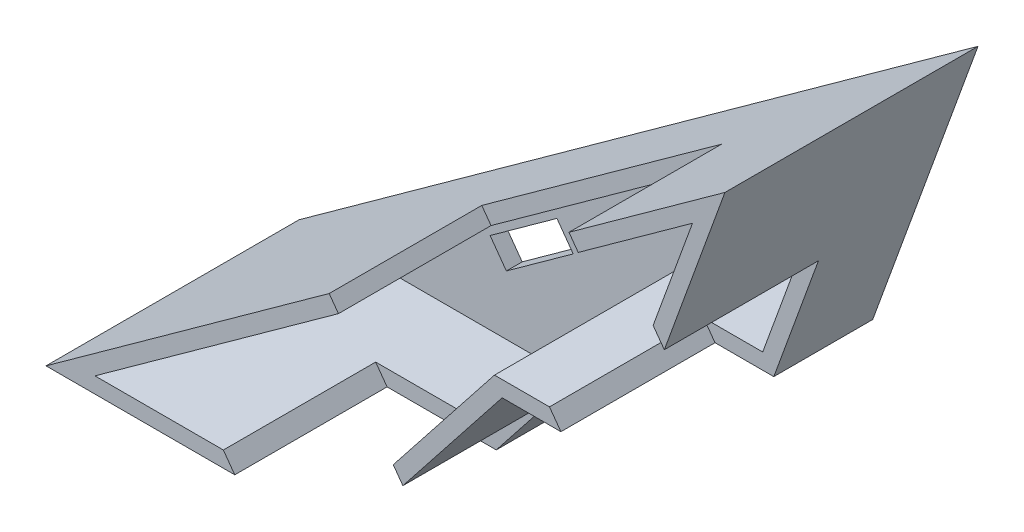
ISO-10303-21;
HEADER;
FILE_DESCRIPTION(('STEP AP214'),'2;1');
FILE_NAME('part.step','',(''),(''),'','','');
FILE_SCHEMA(('AUTOMOTIVE_DESIGN { 1 0 10303 214 1 1 1 1 }'));
ENDSEC;
DATA;
#1=APPLICATION_CONTEXT('core data for automotive mechanical design processes');
#2=APPLICATION_PROTOCOL_DEFINITION('international standard','automotive_design',2000,#1);
#3=PRODUCT_CONTEXT('',#1,'mechanical');
#4=PRODUCT('Part','Part','',(#3));
#5=PRODUCT_RELATED_PRODUCT_CATEGORY('part','',(#4));
#6=PRODUCT_DEFINITION_FORMATION('','',#4);
#7=PRODUCT_DEFINITION_CONTEXT('part definition',#1,'design');
#8=PRODUCT_DEFINITION('design','',#6,#7);
#9=PRODUCT_DEFINITION_SHAPE('','',#8);
#10=(LENGTH_UNIT() NAMED_UNIT(*) SI_UNIT(.MILLI.,.METRE.));
#11=(NAMED_UNIT(*) PLANE_ANGLE_UNIT() SI_UNIT($,.RADIAN.));
#12=(NAMED_UNIT(*) SI_UNIT($,.STERADIAN.) SOLID_ANGLE_UNIT());
#13=UNCERTAINTY_MEASURE_WITH_UNIT(LENGTH_MEASURE(1.E-05),#10,'distance_accuracy_value','');
#14=(GEOMETRIC_REPRESENTATION_CONTEXT(3) GLOBAL_UNCERTAINTY_ASSIGNED_CONTEXT((#13)) GLOBAL_UNIT_ASSIGNED_CONTEXT((#10,
#11,#12)) REPRESENTATION_CONTEXT('',''));
#15=CARTESIAN_POINT('',(0.,0.,0.));
#16=DIRECTION('',(0.,0.,1.));
#17=DIRECTION('',(1.,0.,0.));
#18=AXIS2_PLACEMENT_3D('',#15,#16,#17);
#19=CARTESIAN_POINT('',(0.,0.,0.));
#20=DIRECTION('',(0.,0.,1.));
#21=DIRECTION('',(1.,0.,0.));
#22=AXIS2_PLACEMENT_3D('',#19,#20,#21);
#23=PLANE('',#22);
#24=DIRECTION('',(-0.811073155434757,-0.584944729468611,0.));
#25=VECTOR('',#24,1.);
#26=CARTESIAN_POINT('',(44.82743210089,-62.1568585413798,0.));
#27=LINE('',#26,#25);
#28=CARTESIAN_POINT('',(138.661841082825,5.5163748889184,0.));
#29=VERTEX_POINT('',#28);
#30=CARTESIAN_POINT('',(118.940061752655,-8.70694245012218,0.));
#31=VERTEX_POINT('',#30);
#32=EDGE_CURVE('E618',#29,#31,#27,.T.);
#33=ORIENTED_EDGE('',*,*,#32,.T.);
#34=DIRECTION('',(-0.584944729468611,0.811073155434757,0.));
#35=VECTOR('',#34,1.);
#36=CARTESIAN_POINT('',(124.789509047342,-16.8176740044697,0.));
#37=LINE('',#36,#35);
#38=CARTESIAN_POINT('',(120.109951211593,-10.3290887609917,0.));
#39=VERTEX_POINT('',#38);
#40=EDGE_CURVE('E327',#39,#31,#37,.T.);
#41=ORIENTED_EDGE('',*,*,#40,.F.);
#42=DIRECTION('',(-0.811073155434757,-0.584944729468611,0.));
#43=VECTOR('',#42,1.);
#44=CARTESIAN_POINT('',(134.559011277028,0.0915514419516997,0.));
#45=LINE('',#44,#43);
#46=CARTESIAN_POINT('',(134.559011277028,0.0915514419516997,0.));
#47=VERTEX_POINT('',#46);
#48=EDGE_CURVE('E430',#47,#39,#45,.T.);
#49=ORIENTED_EDGE('',*,*,#48,.F.);
#50=DIRECTION('',(0.342020143325668,0.939692620785909,0.));
#51=VECTOR('',#50,1.);
#52=CARTESIAN_POINT('',(123.949416553981,-29.058070489185,0.));
#53=LINE('',#52,#51);
#54=CARTESIAN_POINT('',(129.582037213865,-13.5825724137994,0.));
#55=VERTEX_POINT('',#54);
#56=EDGE_CURVE('E411',#55,#47,#53,.T.);
#57=ORIENTED_EDGE('',*,*,#56,.F.);
#58=DIRECTION('',(-0.584944729468611,0.811073155434757,0.));
#59=VECTOR('',#58,1.);
#60=CARTESIAN_POINT('',(153.459796919553,-46.6910165685129,0.));
#61=LINE('',#60,#59);
#62=CARTESIAN_POINT('',(130.996533195944,-15.5438854434541,0.));
#63=VERTEX_POINT('',#62);
#64=EDGE_CURVE('E341',#63,#55,#61,.T.);
#65=ORIENTED_EDGE('',*,*,#64,.F.);
#66=DIRECTION('',(0.342020143325668,0.939692620785909,0.));
#67=VECTOR('',#66,1.);
#68=CARTESIAN_POINT('',(120.668558243993,-43.9197634126311,0.));
#69=LINE('',#68,#67);
#70=EDGE_CURVE('E605',#63,#29,#69,.T.);
#71=ORIENTED_EDGE('',*,*,#70,.T.);
#72=EDGE_LOOP('',(#33,#41,#49,#57,#65,#71));
#73=FACE_BOUND('',#72,.T.);
#74=ADVANCED_FACE('F51',(#73),#23,.T.);
#75=CARTESIAN_POINT('',(89.7883227628186,-32.197001206582,0.));
#76=VERTEX_POINT('',#75);
#77=CARTESIAN_POINT('',(59.0007747529941,-54.4009341328978,0.));
#78=VERTEX_POINT('',#77);
#79=EDGE_CURVE('E397',#76,#78,#45,.T.);
#80=ORIENTED_EDGE('',*,*,#79,.F.);
#81=DIRECTION('',(-0.584944729468611,0.811073155434757,0.));
#82=VECTOR('',#81,1.);
#83=CARTESIAN_POINT('',(94.4678805985674,-38.6855864500601,0.));
#84=LINE('',#83,#82);
#85=CARTESIAN_POINT('',(88.6184333038813,-30.5748548957125,0.));
#86=VERTEX_POINT('',#85);
#87=EDGE_CURVE('E330',#76,#86,#84,.T.);
#88=ORIENTED_EDGE('',*,*,#87,.T.);
#89=CARTESIAN_POINT('',(52.8084866129505,-56.4009341328978,0.));
#90=VERTEX_POINT('',#89);
#91=EDGE_CURVE('E546',#86,#90,#27,.T.);
#92=ORIENTED_EDGE('',*,*,#91,.T.);
#93=DIRECTION('',(1.,0.,0.));
#94=VECTOR('',#93,1.);
#95=CARTESIAN_POINT('',(0.,-56.4009341328978,0.));
#96=LINE('',#95,#94);
#97=CARTESIAN_POINT('',(76.6788534974755,-56.4009341328978,0.));
#98=VERTEX_POINT('',#97);
#99=EDGE_CURVE('E620',#90,#98,#96,.T.);
#100=ORIENTED_EDGE('',*,*,#99,.T.);
#101=DIRECTION('',(-0.584944729468611,0.811073155434757,0.));
#102=VECTOR('',#101,1.);
#103=CARTESIAN_POINT('',(98.3435419339969,-86.4407760640886,0.));
#104=LINE('',#103,#102);
#105=CARTESIAN_POINT('',(75.2364565310636,-54.4009341328978,0.));
#106=VERTEX_POINT('',#105);
#107=EDGE_CURVE('E348',#98,#106,#104,.T.);
#108=ORIENTED_EDGE('',*,*,#107,.T.);
#109=DIRECTION('',(1.,0.,0.));
#110=VECTOR('',#109,1.);
#111=CARTESIAN_POINT('',(59.0007747529941,-54.4009341328978,0.));
#112=LINE('',#111,#110);
#113=EDGE_CURVE('E427',#78,#106,#112,.T.);
#114=ORIENTED_EDGE('',*,*,#113,.F.);
#115=EDGE_LOOP('',(#80,#88,#92,#100,#108,#114));
#116=FACE_BOUND('',#115,.T.);
#117=ADVANCED_FACE('F680',(#116),#23,.T.);
#118=CARTESIAN_POINT('',(44.82743210089,-62.1568585413798,0.));
#119=DIRECTION('',(-0.584944729468611,0.811073155434757,0.));
#120=DIRECTION('',(-0.811073155434757,-0.584944729468611,0.));
#121=AXIS2_PLACEMENT_3D('',#118,#119,#120);
#122=PLANE('',#121);
#123=DIRECTION('',(0.811073155434757,0.584944729468611,0.));
#124=VECTOR('',#123,1.);
#125=CARTESIAN_POINT('',(44.82743210089,-62.1568585413798,-19.2971361370837));
#126=LINE('',#125,#124);
#127=CARTESIAN_POINT('',(88.6184333038813,-30.5748548957125,-19.2971361370837));
#128=VERTEX_POINT('',#127);
#129=CARTESIAN_POINT('',(118.940061752655,-8.70694245012217,-19.2971361370837));
#130=VERTEX_POINT('',#129);
#131=EDGE_CURVE('E320',#128,#130,#126,.T.);
#132=ORIENTED_EDGE('',*,*,#131,.T.);
#133=DIRECTION('',(0.,0.,1.));
#134=VECTOR('',#133,1.);
#135=CARTESIAN_POINT('',(118.940061752655,-8.70694245012218,0.));
#136=LINE('',#135,#134);
#137=EDGE_CURVE('E317',#130,#31,#136,.T.);
#138=ORIENTED_EDGE('',*,*,#137,.T.);
#139=ORIENTED_EDGE('',*,*,#32,.F.);
#140=DIRECTION('',(0.,0.,-1.));
#141=VECTOR('',#140,1.);
#142=CARTESIAN_POINT('',(138.661841082825,5.51637488891842,0.));
#143=LINE('',#142,#141);
#144=CARTESIAN_POINT('',(138.661841082825,5.51637488891841,-32.));
#145=VERTEX_POINT('',#144);
#146=EDGE_CURVE('E590',#29,#145,#143,.T.);
#147=ORIENTED_EDGE('',*,*,#146,.T.);
#148=DIRECTION('',(-0.811073155434757,-0.584944729468611,0.));
#149=VECTOR('',#148,1.);
#150=CARTESIAN_POINT('',(44.82743210089,-62.1568585413798,-32.));
#151=LINE('',#150,#149);
#152=CARTESIAN_POINT('',(52.8084866129505,-56.4009341328978,-32.));
#153=VERTEX_POINT('',#152);
#154=EDGE_CURVE('E581',#145,#153,#151,.T.);
#155=ORIENTED_EDGE('',*,*,#154,.T.);
#156=DIRECTION('',(0.,0.,-1.));
#157=VECTOR('',#156,1.);
#158=CARTESIAN_POINT('',(52.8084866129505,-56.4009341328978,0.));
#159=LINE('',#158,#157);
#160=EDGE_CURVE('E610',#90,#153,#159,.T.);
#161=ORIENTED_EDGE('',*,*,#160,.F.);
#162=ORIENTED_EDGE('',*,*,#91,.F.);
#163=DIRECTION('',(0.,0.,-1.));
#164=VECTOR('',#163,1.);
#165=CARTESIAN_POINT('',(88.6184333038813,-30.5748548957125,0.));
#166=LINE('',#165,#164);
#167=EDGE_CURVE('E323',#86,#128,#166,.T.);
#168=ORIENTED_EDGE('',*,*,#167,.T.);
#169=EDGE_LOOP('',(#132,#138,#139,#147,#155,#161,#162,#168));
#170=FACE_BOUND('',#169,.T.);
#171=ADVANCED_FACE('F53',(#170),#122,.T.);
#172=CARTESIAN_POINT('',(45.9973215598272,-63.7790048522493,0.));
#173=DIRECTION('',(-0.584944729468611,0.811073155434757,0.));
#174=DIRECTION('',(-0.811073155434757,-0.584944729468611,0.));
#175=AXIS2_PLACEMENT_3D('',#172,#173,#174);
#176=PLANE('',#175);
#177=DIRECTION('',(0.,0.,1.));
#178=VECTOR('',#177,1.);
#179=CARTESIAN_POINT('',(120.109951211593,-10.3290887609917,0.));
#180=LINE('',#179,#178);
#181=CARTESIAN_POINT('',(120.109951211593,-10.3290887609917,-19.2971361370837));
#182=VERTEX_POINT('',#181);
#183=EDGE_CURVE('E12',#182,#39,#180,.T.);
#184=ORIENTED_EDGE('',*,*,#183,.F.);
#185=DIRECTION('',(0.811073155434757,0.584944729468611,0.));
#186=VECTOR('',#185,1.);
#187=CARTESIAN_POINT('',(45.9973215598272,-63.7790048522493,-19.2971361370837));
#188=LINE('',#187,#186);
#189=CARTESIAN_POINT('',(89.7883227628186,-32.197001206582,-19.2971361370837));
#190=VERTEX_POINT('',#189);
#191=EDGE_CURVE('E600',#190,#182,#188,.T.);
#192=ORIENTED_EDGE('',*,*,#191,.F.);
#193=DIRECTION('',(0.,0.,-1.));
#194=VECTOR('',#193,1.);
#195=CARTESIAN_POINT('',(89.7883227628186,-32.197001206582,0.));
#196=LINE('',#195,#194);
#197=EDGE_CURVE('E59',#76,#190,#196,.T.);
#198=ORIENTED_EDGE('',*,*,#197,.F.);
#199=ORIENTED_EDGE('',*,*,#79,.T.);
#200=DIRECTION('',(0.,0.,-1.));
#201=VECTOR('',#200,1.);
#202=CARTESIAN_POINT('',(59.0007747529941,-54.4009341328978,0.));
#203=LINE('',#202,#201);
#204=CARTESIAN_POINT('',(59.0007747529941,-54.4009341328978,-30.));
#205=VERTEX_POINT('',#204);
#206=EDGE_CURVE('E437',#78,#205,#203,.T.);
#207=ORIENTED_EDGE('',*,*,#206,.T.);
#208=DIRECTION('',(-0.811073155434757,-0.584944729468611,0.));
#209=VECTOR('',#208,1.);
#210=CARTESIAN_POINT('',(59.0007747529941,-54.4009341328978,-30.));
#211=LINE('',#210,#209);
#212=CARTESIAN_POINT('',(134.559011277028,0.0915514419516858,-30.));
#213=VERTEX_POINT('',#212);
#214=EDGE_CURVE('E574',#213,#205,#211,.T.);
#215=ORIENTED_EDGE('',*,*,#214,.F.);
#216=DIRECTION('',(0.,0.,-1.));
#217=VECTOR('',#216,1.);
#218=CARTESIAN_POINT('',(134.559011277028,0.0915514419516997,0.));
#219=LINE('',#218,#217);
#220=EDGE_CURVE('E400',#47,#213,#219,.T.);
#221=ORIENTED_EDGE('',*,*,#220,.F.);
#222=ORIENTED_EDGE('',*,*,#48,.T.);
#223=EDGE_LOOP('',(#184,#192,#198,#199,#207,#215,#221,#222));
#224=FACE_BOUND('',#223,.T.);
#225=ADVANCED_FACE('F473',(#224),#176,.F.);
#226=DIRECTION('',(1.,0.,0.));
#227=VECTOR('',#226,1.);
#228=CARTESIAN_POINT('',(0.,-31.058070489185,0.));
#229=LINE('',#228,#227);
#230=CARTESIAN_POINT('',(110.48856931646,-31.058070489185,0.));
#231=VERTEX_POINT('',#230);
#232=CARTESIAN_POINT('',(117.91920047343,-31.058070489185,0.));
#233=VERTEX_POINT('',#232);
#234=EDGE_CURVE('E614',#231,#233,#229,.T.);
#235=ORIENTED_EDGE('',*,*,#234,.T.);
#236=DIRECTION('',(-0.584944729468611,0.811073155434757,0.));
#237=VECTOR('',#236,1.);
#238=CARTESIAN_POINT('',(137.496567912972,-58.2036731151286,0.));
#239=LINE('',#238,#237);
#240=CARTESIAN_POINT('',(116.476803507018,-29.058070489185,0.));
#241=VERTEX_POINT('',#240);
#242=EDGE_CURVE('E338',#233,#241,#239,.T.);
#243=ORIENTED_EDGE('',*,*,#242,.T.);
#244=DIRECTION('',(1.,0.,0.));
#245=VECTOR('',#244,1.);
#246=CARTESIAN_POINT('',(109.519294052735,-29.058070489185,0.));
#247=LINE('',#246,#245);
#248=CARTESIAN_POINT('',(109.519294052735,-29.058070489185,0.));
#249=VERTEX_POINT('',#248);
#250=EDGE_CURVE('E414',#249,#241,#247,.T.);
#251=ORIENTED_EDGE('',*,*,#250,.F.);
#252=DIRECTION('',(0.61959891650617,0.784918583462247,0.));
#253=VECTOR('',#252,1.);
#254=CARTESIAN_POINT('',(89.5141480597006,-54.4009341328978,0.));
#255=LINE('',#254,#253);
#256=CARTESIAN_POINT('',(96.7206513157647,-45.2716116360765,0.));
#257=VERTEX_POINT('',#256);
#258=EDGE_CURVE('E408',#257,#249,#255,.T.);
#259=ORIENTED_EDGE('',*,*,#258,.F.);
#260=DIRECTION('',(-0.584944729468611,0.811073155434757,0.));
#261=VECTOR('',#260,1.);
#262=CARTESIAN_POINT('',(116.807948964317,-73.1242737205247,0.));
#263=LINE('',#262,#261);
#264=CARTESIAN_POINT('',(97.9371648267909,-46.958405964343,0.));
#265=VERTEX_POINT('',#264);
#266=EDGE_CURVE('E351',#265,#257,#263,.T.);
#267=ORIENTED_EDGE('',*,*,#266,.F.);
#268=DIRECTION('',(0.61959891650617,0.784918583462247,0.));
#269=VECTOR('',#268,1.);
#270=CARTESIAN_POINT('',(83.1763137862714,-65.6577064001055,0.));
#271=LINE('',#270,#269);
#272=EDGE_CURVE('E420',#265,#231,#271,.T.);
#273=ORIENTED_EDGE('',*,*,#272,.T.);
#274=EDGE_LOOP('',(#235,#243,#251,#259,#267,#273));
#275=FACE_BOUND('',#274,.T.);
#276=ADVANCED_FACE('F477',(#275),#23,.T.);
#277=CARTESIAN_POINT('',(0.,-31.058070489185,0.));
#278=DIRECTION('',(0.,-1.,0.));
#279=DIRECTION('',(0.,0.,-1.));
#280=AXIS2_PLACEMENT_3D('',#277,#278,#279);
#281=PLANE('',#280);
#282=DIRECTION('',(0.,0.,-1.));
#283=VECTOR('',#282,1.);
#284=CARTESIAN_POINT('',(125.3498316304,-31.058070489185,0.));
#285=LINE('',#284,#283);
#286=CARTESIAN_POINT('',(125.3498316304,-31.058070489185,-19.4890431976789));
#287=VERTEX_POINT('',#286);
#288=CARTESIAN_POINT('',(125.3498316304,-31.058070489185,-32.));
#289=VERTEX_POINT('',#288);
#290=EDGE_CURVE('E604',#287,#289,#285,.T.);
#291=ORIENTED_EDGE('',*,*,#290,.F.);
#292=DIRECTION('',(-1.,0.,0.));
#293=VECTOR('',#292,1.);
#294=CARTESIAN_POINT('',(0.,-31.058070489185,-19.4890431976789));
#295=LINE('',#294,#293);
#296=CARTESIAN_POINT('',(117.91920047343,-31.058070489185,-19.4890431976789));
#297=VERTEX_POINT('',#296);
#298=EDGE_CURVE('E394',#287,#297,#295,.T.);
#299=ORIENTED_EDGE('',*,*,#298,.T.);
#300=DIRECTION('',(0.,0.,1.));
#301=VECTOR('',#300,1.);
#302=CARTESIAN_POINT('',(117.91920047343,-31.058070489185,0.));
#303=LINE('',#302,#301);
#304=EDGE_CURVE('E379',#297,#233,#303,.T.);
#305=ORIENTED_EDGE('',*,*,#304,.T.);
#306=ORIENTED_EDGE('',*,*,#234,.F.);
#307=DIRECTION('',(0.,0.,-1.));
#308=VECTOR('',#307,1.);
#309=CARTESIAN_POINT('',(110.48856931646,-31.058070489185,0.));
#310=LINE('',#309,#308);
#311=CARTESIAN_POINT('',(110.48856931646,-31.058070489185,-32.));
#312=VERTEX_POINT('',#311);
#313=EDGE_CURVE('E601',#231,#312,#310,.T.);
#314=ORIENTED_EDGE('',*,*,#313,.T.);
#315=DIRECTION('',(1.,0.,0.));
#316=VECTOR('',#315,1.);
#317=CARTESIAN_POINT('',(0.,-31.058070489185,-32.));
#318=LINE('',#317,#316);
#319=EDGE_CURVE('E592',#312,#289,#318,.T.);
#320=ORIENTED_EDGE('',*,*,#319,.T.);
#321=EDGE_LOOP('',(#291,#299,#305,#306,#314,#320));
#322=FACE_BOUND('',#321,.T.);
#323=ADVANCED_FACE('F633',(#322),#281,.T.);
#324=CARTESIAN_POINT('',(120.668558243993,-43.9197634126311,0.));
#325=DIRECTION('',(0.939692620785909,-0.342020143325668,0.));
#326=DIRECTION('',(0.342020143325668,0.939692620785909,0.));
#327=AXIS2_PLACEMENT_3D('',#324,#325,#326);
#328=PLANE('',#327);
#329=DIRECTION('',(0.,0.,-1.));
#330=VECTOR('',#329,1.);
#331=CARTESIAN_POINT('',(130.996533195944,-15.5438854434541,0.));
#332=LINE('',#331,#330);
#333=CARTESIAN_POINT('',(130.996533195944,-15.5438854434541,-19.4890431976789));
#334=VERTEX_POINT('',#333);
#335=EDGE_CURVE('E384',#63,#334,#332,.T.);
#336=ORIENTED_EDGE('',*,*,#335,.T.);
#337=DIRECTION('',(-0.342020143325668,-0.939692620785909,0.));
#338=VECTOR('',#337,1.);
#339=CARTESIAN_POINT('',(120.668558243993,-43.9197634126311,-19.4890431976789));
#340=LINE('',#339,#338);
#341=EDGE_CURVE('E391',#334,#287,#340,.T.);
#342=ORIENTED_EDGE('',*,*,#341,.T.);
#343=ORIENTED_EDGE('',*,*,#290,.T.);
#344=DIRECTION('',(0.342020143325668,0.939692620785909,0.));
#345=VECTOR('',#344,1.);
#346=CARTESIAN_POINT('',(120.668558243993,-43.9197634126311,-32.));
#347=LINE('',#346,#345);
#348=EDGE_CURVE('E589',#289,#145,#347,.T.);
#349=ORIENTED_EDGE('',*,*,#348,.T.);
#350=ORIENTED_EDGE('',*,*,#146,.F.);
#351=ORIENTED_EDGE('',*,*,#70,.F.);
#352=EDGE_LOOP('',(#336,#342,#343,#349,#350,#351));
#353=FACE_BOUND('',#352,.T.);
#354=ADVANCED_FACE('F642',(#353),#328,.T.);
#355=CARTESIAN_POINT('',(83.1763137862714,-65.6577064001055,0.));
#356=DIRECTION('',(0.784918583462247,-0.61959891650617,0.));
#357=DIRECTION('',(0.61959891650617,0.784918583462247,0.));
#358=AXIS2_PLACEMENT_3D('',#355,#356,#357);
#359=PLANE('',#358);
#360=DIRECTION('',(0.,0.,-1.));
#361=VECTOR('',#360,1.);
#362=CARTESIAN_POINT('',(97.9371648267909,-46.958405964343,0.));
#363=LINE('',#362,#361);
#364=CARTESIAN_POINT('',(97.9371648267909,-46.958405964343,-19.2613891703371));
#365=VERTEX_POINT('',#364);
#366=EDGE_CURVE('E363',#265,#365,#363,.T.);
#367=ORIENTED_EDGE('',*,*,#366,.T.);
#368=DIRECTION('',(-0.61959891650617,-0.784918583462247,0.));
#369=VECTOR('',#368,1.);
#370=CARTESIAN_POINT('',(83.1763137862714,-65.6577064001055,-19.2613891703371));
#371=LINE('',#370,#369);
#372=CARTESIAN_POINT('',(90.4834233234252,-56.4009341328978,-19.2613891703371));
#373=VERTEX_POINT('',#372);
#374=EDGE_CURVE('E374',#365,#373,#371,.T.);
#375=ORIENTED_EDGE('',*,*,#374,.T.);
#376=DIRECTION('',(0.,0.,-1.));
#377=VECTOR('',#376,1.);
#378=CARTESIAN_POINT('',(90.4834233234252,-56.4009341328978,0.));
#379=LINE('',#378,#377);
#380=CARTESIAN_POINT('',(90.4834233234252,-56.4009341328978,-32.));
#381=VERTEX_POINT('',#380);
#382=EDGE_CURVE('E607',#373,#381,#379,.T.);
#383=ORIENTED_EDGE('',*,*,#382,.T.);
#384=DIRECTION('',(0.61959891650617,0.784918583462247,0.));
#385=VECTOR('',#384,1.);
#386=CARTESIAN_POINT('',(83.1763137862714,-65.6577064001055,-32.));
#387=LINE('',#386,#385);
#388=EDGE_CURVE('E595',#381,#312,#387,.T.);
#389=ORIENTED_EDGE('',*,*,#388,.T.);
#390=ORIENTED_EDGE('',*,*,#313,.F.);
#391=ORIENTED_EDGE('',*,*,#272,.F.);
#392=EDGE_LOOP('',(#367,#375,#383,#389,#390,#391));
#393=FACE_BOUND('',#392,.T.);
#394=ADVANCED_FACE('F635',(#393),#359,.T.);
#395=CARTESIAN_POINT('',(0.,-56.4009341328978,0.));
#396=DIRECTION('',(0.,-1.,0.));
#397=DIRECTION('',(0.,0.,-1.));
#398=AXIS2_PLACEMENT_3D('',#395,#396,#397);
#399=PLANE('',#398);
#400=ORIENTED_EDGE('',*,*,#382,.F.);
#401=DIRECTION('',(-1.,0.,0.));
#402=VECTOR('',#401,1.);
#403=CARTESIAN_POINT('',(0.,-56.4009341328978,-19.2613891703371));
#404=LINE('',#403,#402);
#405=CARTESIAN_POINT('',(76.6788534974755,-56.4009341328978,-19.2613891703371));
#406=VERTEX_POINT('',#405);
#407=EDGE_CURVE('E371',#373,#406,#404,.T.);
#408=ORIENTED_EDGE('',*,*,#407,.T.);
#409=DIRECTION('',(0.,0.,1.));
#410=VECTOR('',#409,1.);
#411=CARTESIAN_POINT('',(76.6788534974755,-56.4009341328978,0.));
#412=LINE('',#411,#410);
#413=EDGE_CURVE('E358',#406,#98,#412,.T.);
#414=ORIENTED_EDGE('',*,*,#413,.T.);
#415=ORIENTED_EDGE('',*,*,#99,.F.);
#416=ORIENTED_EDGE('',*,*,#160,.T.);
#417=DIRECTION('',(1.,0.,0.));
#418=VECTOR('',#417,1.);
#419=CARTESIAN_POINT('',(0.,-56.4009341328978,-32.));
#420=LINE('',#419,#418);
#421=EDGE_CURVE('E597',#153,#381,#420,.T.);
#422=ORIENTED_EDGE('',*,*,#421,.T.);
#423=EDGE_LOOP('',(#400,#408,#414,#415,#416,#422));
#424=FACE_BOUND('',#423,.T.);
#425=ADVANCED_FACE('F513',(#424),#399,.T.);
#426=CARTESIAN_POINT('',(0.,-29.058070489185,0.));
#427=DIRECTION('',(0.,-1.,0.));
#428=DIRECTION('',(0.,0.,-1.));
#429=AXIS2_PLACEMENT_3D('',#426,#427,#428);
#430=PLANE('',#429);
#431=DIRECTION('',(-1.,0.,0.));
#432=VECTOR('',#431,1.);
#433=CARTESIAN_POINT('',(0.,-29.058070489185,-19.4890431976789));
#434=LINE('',#433,#432);
#435=CARTESIAN_POINT('',(123.949416553981,-29.0580704891851,-19.4890431976789));
#436=VERTEX_POINT('',#435);
#437=CARTESIAN_POINT('',(116.476803507018,-29.058070489185,-19.4890431976789));
#438=VERTEX_POINT('',#437);
#439=EDGE_CURVE('E389',#436,#438,#434,.T.);
#440=ORIENTED_EDGE('',*,*,#439,.F.);
#441=DIRECTION('',(0.,0.,-1.));
#442=VECTOR('',#441,1.);
#443=CARTESIAN_POINT('',(123.949416553981,-29.058070489185,0.));
#444=LINE('',#443,#442);
#445=CARTESIAN_POINT('',(123.949416553981,-29.058070489185,-30.));
#446=VERTEX_POINT('',#445);
#447=EDGE_CURVE('E403',#436,#446,#444,.T.);
#448=ORIENTED_EDGE('',*,*,#447,.T.);
#449=DIRECTION('',(1.,0.,0.));
#450=VECTOR('',#449,1.);
#451=CARTESIAN_POINT('',(123.949416553981,-29.058070489185,-30.));
#452=LINE('',#451,#450);
#453=CARTESIAN_POINT('',(109.519294052735,-29.058070489185,-30.));
#454=VERTEX_POINT('',#453);
#455=EDGE_CURVE('E561',#454,#446,#452,.T.);
#456=ORIENTED_EDGE('',*,*,#455,.F.);
#457=DIRECTION('',(0.,0.,-1.));
#458=VECTOR('',#457,1.);
#459=CARTESIAN_POINT('',(109.519294052735,-29.058070489185,0.));
#460=LINE('',#459,#458);
#461=EDGE_CURVE('E407',#249,#454,#460,.T.);
#462=ORIENTED_EDGE('',*,*,#461,.F.);
#463=ORIENTED_EDGE('',*,*,#250,.T.);
#464=DIRECTION('',(0.,0.,1.));
#465=VECTOR('',#464,1.);
#466=CARTESIAN_POINT('',(116.476803507018,-29.058070489185,0.));
#467=LINE('',#466,#465);
#468=EDGE_CURVE('E377',#438,#241,#467,.T.);
#469=ORIENTED_EDGE('',*,*,#468,.F.);
#470=EDGE_LOOP('',(#440,#448,#456,#462,#463,#469));
#471=FACE_BOUND('',#470,.T.);
#472=ADVANCED_FACE('F509',(#471),#430,.F.);
#473=CARTESIAN_POINT('',(118.789173002422,-43.2357231259797,0.));
#474=DIRECTION('',(0.939692620785909,-0.342020143325668,0.));
#475=DIRECTION('',(0.342020143325668,0.939692620785909,0.));
#476=AXIS2_PLACEMENT_3D('',#473,#474,#475);
#477=PLANE('',#476);
#478=DIRECTION('',(-0.342020143325668,-0.939692620785909,0.));
#479=VECTOR('',#478,1.);
#480=CARTESIAN_POINT('',(118.789173002422,-43.2357231259797,-19.4890431976789));
#481=LINE('',#480,#479);
#482=CARTESIAN_POINT('',(129.582037213865,-13.5825724137994,-19.4890431976789));
#483=VERTEX_POINT('',#482);
#484=EDGE_CURVE('E387',#483,#436,#481,.T.);
#485=ORIENTED_EDGE('',*,*,#484,.F.);
#486=DIRECTION('',(0.,0.,-1.));
#487=VECTOR('',#486,1.);
#488=CARTESIAN_POINT('',(129.582037213865,-13.5825724137994,0.));
#489=LINE('',#488,#487);
#490=EDGE_CURVE('E382',#55,#483,#489,.T.);
#491=ORIENTED_EDGE('',*,*,#490,.F.);
#492=ORIENTED_EDGE('',*,*,#56,.T.);
#493=ORIENTED_EDGE('',*,*,#220,.T.);
#494=DIRECTION('',(0.342020143325668,0.939692620785909,0.));
#495=VECTOR('',#494,1.);
#496=CARTESIAN_POINT('',(134.559011277028,0.0915514419516997,-30.));
#497=LINE('',#496,#495);
#498=EDGE_CURVE('E494',#446,#213,#497,.T.);
#499=ORIENTED_EDGE('',*,*,#498,.F.);
#500=ORIENTED_EDGE('',*,*,#447,.F.);
#501=EDGE_LOOP('',(#485,#491,#492,#493,#499,#500));
#502=FACE_BOUND('',#501,.T.);
#503=ADVANCED_FACE('F500',(#502),#477,.F.);
#504=CARTESIAN_POINT('',(81.6064766193469,-64.4185085670932,0.));
#505=DIRECTION('',(0.784918583462247,-0.61959891650617,0.));
#506=DIRECTION('',(0.61959891650617,0.784918583462247,0.));
#507=AXIS2_PLACEMENT_3D('',#504,#505,#506);
#508=PLANE('',#507);
#509=DIRECTION('',(-0.61959891650617,-0.784918583462247,0.));
#510=VECTOR('',#509,1.);
#511=CARTESIAN_POINT('',(81.6064766193469,-64.4185085670932,-19.2613891703371));
#512=LINE('',#511,#510);
#513=CARTESIAN_POINT('',(96.7206513157647,-45.2716116360765,-19.2613891703371));
#514=VERTEX_POINT('',#513);
#515=CARTESIAN_POINT('',(89.5141480597006,-54.4009341328978,-19.2613891703371));
#516=VERTEX_POINT('',#515);
#517=EDGE_CURVE('E369',#514,#516,#512,.T.);
#518=ORIENTED_EDGE('',*,*,#517,.F.);
#519=DIRECTION('',(0.,0.,-1.));
#520=VECTOR('',#519,1.);
#521=CARTESIAN_POINT('',(96.7206513157647,-45.2716116360765,0.));
#522=LINE('',#521,#520);
#523=EDGE_CURVE('E361',#257,#514,#522,.T.);
#524=ORIENTED_EDGE('',*,*,#523,.F.);
#525=ORIENTED_EDGE('',*,*,#258,.T.);
#526=ORIENTED_EDGE('',*,*,#461,.T.);
#527=DIRECTION('',(0.61959891650617,0.784918583462247,0.));
#528=VECTOR('',#527,1.);
#529=CARTESIAN_POINT('',(109.519294052735,-29.058070489185,-30.));
#530=LINE('',#529,#528);
#531=CARTESIAN_POINT('',(89.5141480597006,-54.4009341328978,-30.));
#532=VERTEX_POINT('',#531);
#533=EDGE_CURVE('E530',#532,#454,#530,.T.);
#534=ORIENTED_EDGE('',*,*,#533,.F.);
#535=DIRECTION('',(0.,0.,-1.));
#536=VECTOR('',#535,1.);
#537=CARTESIAN_POINT('',(89.5141480597006,-54.4009341328978,0.));
#538=LINE('',#537,#536);
#539=EDGE_CURVE('E406',#516,#532,#538,.T.);
#540=ORIENTED_EDGE('',*,*,#539,.F.);
#541=EDGE_LOOP('',(#518,#524,#525,#526,#534,#540));
#542=FACE_BOUND('',#541,.T.);
#543=ADVANCED_FACE('F470',(#542),#508,.F.);
#544=CARTESIAN_POINT('',(0.,-54.4009341328978,0.));
#545=DIRECTION('',(0.,-1.,0.));
#546=DIRECTION('',(0.,0.,-1.));
#547=AXIS2_PLACEMENT_3D('',#544,#545,#546);
#548=PLANE('',#547);
#549=DIRECTION('',(-1.,0.,0.));
#550=VECTOR('',#549,1.);
#551=CARTESIAN_POINT('',(0.,-54.4009341328978,-19.2613891703371));
#552=LINE('',#551,#550);
#553=CARTESIAN_POINT('',(75.2364565310636,-54.4009341328978,-19.2613891703371));
#554=VERTEX_POINT('',#553);
#555=EDGE_CURVE('E366',#516,#554,#552,.T.);
#556=ORIENTED_EDGE('',*,*,#555,.F.);
#557=ORIENTED_EDGE('',*,*,#539,.T.);
#558=DIRECTION('',(1.,0.,0.));
#559=VECTOR('',#558,1.);
#560=CARTESIAN_POINT('',(89.5141480597006,-54.4009341328978,-30.));
#561=LINE('',#560,#559);
#562=EDGE_CURVE('E451',#205,#532,#561,.T.);
#563=ORIENTED_EDGE('',*,*,#562,.F.);
#564=ORIENTED_EDGE('',*,*,#206,.F.);
#565=ORIENTED_EDGE('',*,*,#113,.T.);
#566=DIRECTION('',(0.,0.,1.));
#567=VECTOR('',#566,1.);
#568=CARTESIAN_POINT('',(75.2364565310636,-54.4009341328978,0.));
#569=LINE('',#568,#567);
#570=EDGE_CURVE('E356',#554,#106,#569,.T.);
#571=ORIENTED_EDGE('',*,*,#570,.F.);
#572=EDGE_LOOP('',(#556,#557,#563,#564,#565,#571));
#573=FACE_BOUND('',#572,.T.);
#574=ADVANCED_FACE('F459',(#573),#548,.F.);
#575=CARTESIAN_POINT('',(0.,0.,-32.));
#576=DIRECTION('',(0.,0.,1.));
#577=DIRECTION('',(1.,0.,0.));
#578=AXIS2_PLACEMENT_3D('',#575,#576,#577);
#579=PLANE('',#578);
#580=DIRECTION('',(-0.584944729468609,0.811073155434758,0.));
#581=VECTOR('',#580,1.);
#582=CARTESIAN_POINT('',(39.5007921746347,28.4879114017799,-32.));
#583=LINE('',#582,#581);
#584=CARTESIAN_POINT('',(89.4765365173123,-40.8074982620344,-32.));
#585=VERTEX_POINT('',#584);
#586=CARTESIAN_POINT('',(87.4170661960474,-37.951876170166,-32.));
#587=VERTEX_POINT('',#586);
#588=EDGE_CURVE('E311',#585,#587,#583,.T.);
#589=ORIENTED_EDGE('',*,*,#588,.T.);
#590=DIRECTION('',(-0.811073155434757,-0.584944729468611,0.));
#591=VECTOR('',#590,1.);
#592=CARTESIAN_POINT('',(47.916274021413,-66.4397875719459,-32.));
#593=LINE('',#592,#591);
#594=CARTESIAN_POINT('',(78.963932985457,-44.0482630199816,-32.));
#595=VERTEX_POINT('',#594);
#596=EDGE_CURVE('E314',#587,#595,#593,.T.);
#597=ORIENTED_EDGE('',*,*,#596,.T.);
#598=DIRECTION('',(0.584944729468612,-0.811073155434756,0.));
#599=VECTOR('',#598,1.);
#600=CARTESIAN_POINT('',(31.047658964044,22.3915245519642,-32.));
#601=LINE('',#600,#599);
#602=CARTESIAN_POINT('',(81.023403306722,-46.9038851118501,-32.));
#603=VERTEX_POINT('',#602);
#604=EDGE_CURVE('E308',#595,#603,#601,.T.);
#605=ORIENTED_EDGE('',*,*,#604,.T.);
#606=DIRECTION('',(0.811073155434757,0.584944729468612,0.));
#607=VECTOR('',#606,1.);
#608=CARTESIAN_POINT('',(49.9757443426779,-69.2954096638143,-32.));
#609=LINE('',#608,#607);
#610=EDGE_CURVE('E252',#603,#585,#609,.T.);
#611=ORIENTED_EDGE('',*,*,#610,.T.);
#612=EDGE_LOOP('',(#589,#597,#605,#611));
#613=FACE_BOUND('',#612,.T.);
#614=DIRECTION('',(-0.811073155434757,-0.584944729468611,0.));
#615=VECTOR('',#614,1.);
#616=CARTESIAN_POINT('',(46.4345057682934,-64.3851961000772,-32.));
#617=LINE('',#616,#615);
#618=CARTESIAN_POINT('',(118.225703578484,-12.6094931318291,-32.));
#619=VERTEX_POINT('',#618);
#620=CARTESIAN_POINT('',(103.880127444898,-22.9555008800867,-32.));
#621=VERTEX_POINT('',#620);
#622=EDGE_CURVE('E302',#619,#621,#617,.T.);
#623=ORIENTED_EDGE('',*,*,#622,.T.);
#624=DIRECTION('',(0.584944729468613,-0.811073155434756,0.));
#625=VECTOR('',#624,1.);
#626=CARTESIAN_POINT('',(57.4456216766048,41.4296952199905,-32.));
#627=LINE('',#626,#625);
#628=CARTESIAN_POINT('',(106.747619803532,-26.9315108487811,-32.));
#629=VERTEX_POINT('',#628);
#630=EDGE_CURVE('E305',#621,#629,#627,.T.);
#631=ORIENTED_EDGE('',*,*,#630,.T.);
#632=DIRECTION('',(0.811073155434757,0.584944729468611,0.));
#633=VECTOR('',#632,1.);
#634=CARTESIAN_POINT('',(49.3019981269275,-68.3612060687715,-32.));
#635=LINE('',#634,#633);
#636=CARTESIAN_POINT('',(121.093195937118,-16.5855031005235,-32.));
#637=VERTEX_POINT('',#636);
#638=EDGE_CURVE('E276',#629,#637,#635,.T.);
#639=ORIENTED_EDGE('',*,*,#638,.T.);
#640=DIRECTION('',(-0.584944729468613,0.811073155434756,0.));
#641=VECTOR('',#640,1.);
#642=CARTESIAN_POINT('',(71.7911978101907,51.7757029682481,-32.));
#643=LINE('',#642,#641);
#644=EDGE_CURVE('E299',#637,#619,#643,.T.);
#645=ORIENTED_EDGE('',*,*,#644,.T.);
#646=EDGE_LOOP('',(#623,#631,#639,#645));
#647=FACE_BOUND('',#646,.T.);
#648=ORIENTED_EDGE('',*,*,#154,.F.);
#649=ORIENTED_EDGE('',*,*,#348,.F.);
#650=ORIENTED_EDGE('',*,*,#319,.F.);
#651=ORIENTED_EDGE('',*,*,#388,.F.);
#652=ORIENTED_EDGE('',*,*,#421,.F.);
#653=EDGE_LOOP('',(#648,#649,#650,#651,#652));
#654=FACE_BOUND('',#653,.T.);
#655=ADVANCED_FACE('F469',(#613,#647,#654),#579,.F.);
#656=CARTESIAN_POINT('',(0.,0.,-30.));
#657=DIRECTION('',(0.,0.,1.));
#658=DIRECTION('',(1.,0.,0.));
#659=AXIS2_PLACEMENT_3D('',#656,#657,#658);
#660=PLANE('',#659);
#661=DIRECTION('',(-0.811073155434757,-0.584944729468611,0.));
#662=VECTOR('',#661,1.);
#663=CARTESIAN_POINT('',(78.963932985457,-44.0482630199816,-30.));
#664=LINE('',#663,#662);
#665=CARTESIAN_POINT('',(87.4170661960474,-37.951876170166,-30.));
#666=VERTEX_POINT('',#665);
#667=CARTESIAN_POINT('',(78.9639329854571,-44.0482630199816,-30.));
#668=VERTEX_POINT('',#667);
#669=EDGE_CURVE('E264',#666,#668,#664,.T.);
#670=ORIENTED_EDGE('',*,*,#669,.F.);
#671=DIRECTION('',(-0.584944729468609,0.811073155434758,0.));
#672=VECTOR('',#671,1.);
#673=CARTESIAN_POINT('',(87.4170661960474,-37.951876170166,-30.));
#674=LINE('',#673,#672);
#675=CARTESIAN_POINT('',(89.4765365173123,-40.8074982620344,-30.));
#676=VERTEX_POINT('',#675);
#677=EDGE_CURVE('E269',#676,#666,#674,.T.);
#678=ORIENTED_EDGE('',*,*,#677,.F.);
#679=DIRECTION('',(0.811073155434757,0.584944729468612,0.));
#680=VECTOR('',#679,1.);
#681=CARTESIAN_POINT('',(81.023403306722,-46.90388511185,-30.));
#682=LINE('',#681,#680);
#683=CARTESIAN_POINT('',(81.023403306722,-46.90388511185,-30.));
#684=VERTEX_POINT('',#683);
#685=EDGE_CURVE('E249',#684,#676,#682,.T.);
#686=ORIENTED_EDGE('',*,*,#685,.F.);
#687=DIRECTION('',(0.584944729468612,-0.811073155434756,0.));
#688=VECTOR('',#687,1.);
#689=CARTESIAN_POINT('',(78.963932985457,-44.0482630199816,-30.));
#690=LINE('',#689,#688);
#691=EDGE_CURVE('E259',#668,#684,#690,.T.);
#692=ORIENTED_EDGE('',*,*,#691,.F.);
#693=EDGE_LOOP('',(#670,#678,#686,#692));
#694=FACE_BOUND('',#693,.T.);
#695=DIRECTION('',(0.584944729468613,-0.811073155434756,0.));
#696=VECTOR('',#695,1.);
#697=CARTESIAN_POINT('',(103.880127444898,-22.9555008800867,-30.));
#698=LINE('',#697,#696);
#699=CARTESIAN_POINT('',(103.880127444898,-22.9555008800867,-30.));
#700=VERTEX_POINT('',#699);
#701=CARTESIAN_POINT('',(106.747619803532,-26.9315108487811,-30.));
#702=VERTEX_POINT('',#701);
#703=EDGE_CURVE('E295',#700,#702,#698,.T.);
#704=ORIENTED_EDGE('',*,*,#703,.F.);
#705=DIRECTION('',(-0.811073155434757,-0.584944729468611,0.));
#706=VECTOR('',#705,1.);
#707=CARTESIAN_POINT('',(103.880127444898,-22.9555008800867,-30.));
#708=LINE('',#707,#706);
#709=CARTESIAN_POINT('',(118.225703578484,-12.6094931318291,-30.));
#710=VERTEX_POINT('',#709);
#711=EDGE_CURVE('E282',#710,#700,#708,.T.);
#712=ORIENTED_EDGE('',*,*,#711,.F.);
#713=DIRECTION('',(-0.584944729468613,0.811073155434756,0.));
#714=VECTOR('',#713,1.);
#715=CARTESIAN_POINT('',(118.225703578484,-12.6094931318291,-30.));
#716=LINE('',#715,#714);
#717=CARTESIAN_POINT('',(121.093195937118,-16.5855031005235,-30.));
#718=VERTEX_POINT('',#717);
#719=EDGE_CURVE('E290',#718,#710,#716,.T.);
#720=ORIENTED_EDGE('',*,*,#719,.F.);
#721=DIRECTION('',(0.811073155434757,0.584944729468611,0.));
#722=VECTOR('',#721,1.);
#723=CARTESIAN_POINT('',(106.747619803532,-26.9315108487811,-30.));
#724=LINE('',#723,#722);
#725=EDGE_CURVE('E293',#702,#718,#724,.T.);
#726=ORIENTED_EDGE('',*,*,#725,.F.);
#727=EDGE_LOOP('',(#704,#712,#720,#726));
#728=FACE_BOUND('',#727,.T.);
#729=ORIENTED_EDGE('',*,*,#214,.T.);
#730=ORIENTED_EDGE('',*,*,#562,.T.);
#731=ORIENTED_EDGE('',*,*,#533,.T.);
#732=ORIENTED_EDGE('',*,*,#455,.T.);
#733=ORIENTED_EDGE('',*,*,#498,.T.);
#734=EDGE_LOOP('',(#729,#730,#731,#732,#733));
#735=FACE_BOUND('',#734,.T.);
#736=ADVANCED_FACE('F266',(#694,#728,#735),#660,.T.);
#737=CARTESIAN_POINT('',(74.6596133037892,-103.521589468552,-19.2613891703371));
#738=DIRECTION('',(0.,0.,1.));
#739=DIRECTION('',(1.,0.,0.));
#740=AXIS2_PLACEMENT_3D('',#737,#738,#739);
#741=PLANE('',#740);
#742=DIRECTION('',(-0.584944729468611,0.811073155434757,0.));
#743=VECTOR('',#742,1.);
#744=CARTESIAN_POINT('',(116.807948964317,-73.1242737205247,-19.2613891703371));
#745=LINE('',#744,#743);
#746=EDGE_CURVE('E353',#365,#514,#745,.T.);
#747=ORIENTED_EDGE('',*,*,#746,.T.);
#748=ORIENTED_EDGE('',*,*,#517,.T.);
#749=ORIENTED_EDGE('',*,*,#555,.T.);
#750=DIRECTION('',(-0.584944729468611,0.811073155434757,0.));
#751=VECTOR('',#750,1.);
#752=CARTESIAN_POINT('',(98.3435419339969,-86.4407760640886,-19.2613891703371));
#753=LINE('',#752,#751);
#754=EDGE_CURVE('E346',#406,#554,#753,.T.);
#755=ORIENTED_EDGE('',*,*,#754,.F.);
#756=ORIENTED_EDGE('',*,*,#407,.F.);
#757=ORIENTED_EDGE('',*,*,#374,.F.);
#758=EDGE_LOOP('',(#747,#748,#749,#755,#756,#757));
#759=FACE_BOUND('',#758,.T.);
#760=ADVANCED_FACE('F515',(#759),#741,.T.);
#761=CARTESIAN_POINT('',(116.807948964317,-73.1242737205247,0.));
#762=DIRECTION('',(-0.811073155434757,-0.584944729468611,0.));
#763=DIRECTION('',(0.584944729468611,-0.811073155434757,0.));
#764=AXIS2_PLACEMENT_3D('',#761,#762,#763);
#765=PLANE('',#764);
#766=ORIENTED_EDGE('',*,*,#266,.T.);
#767=ORIENTED_EDGE('',*,*,#523,.T.);
#768=ORIENTED_EDGE('',*,*,#746,.F.);
#769=ORIENTED_EDGE('',*,*,#366,.F.);
#770=EDGE_LOOP('',(#766,#767,#768,#769));
#771=FACE_BOUND('',#770,.T.);
#772=ADVANCED_FACE('F675',(#771),#765,.T.);
#773=CARTESIAN_POINT('',(98.3435419339969,-86.4407760640886,0.));
#774=DIRECTION('',(0.811073155434757,0.584944729468611,0.));
#775=DIRECTION('',(-0.584944729468611,0.811073155434757,0.));
#776=AXIS2_PLACEMENT_3D('',#773,#774,#775);
#777=PLANE('',#776);
#778=ORIENTED_EDGE('',*,*,#754,.T.);
#779=ORIENTED_EDGE('',*,*,#570,.T.);
#780=ORIENTED_EDGE('',*,*,#107,.F.);
#781=ORIENTED_EDGE('',*,*,#413,.F.);
#782=EDGE_LOOP('',(#778,#779,#780,#781));
#783=FACE_BOUND('',#782,.T.);
#784=ADVANCED_FACE('F720',(#783),#777,.T.);
#785=CARTESIAN_POINT('',(74.6596133037892,-103.521589468552,-19.4890431976789));
#786=DIRECTION('',(0.,0.,1.));
#787=DIRECTION('',(1.,0.,0.));
#788=AXIS2_PLACEMENT_3D('',#785,#786,#787);
#789=PLANE('',#788);
#790=ORIENTED_EDGE('',*,*,#341,.F.);
#791=DIRECTION('',(-0.584944729468611,0.811073155434757,0.));
#792=VECTOR('',#791,1.);
#793=CARTESIAN_POINT('',(153.459796919553,-46.6910165685129,-19.4890431976789));
#794=LINE('',#793,#792);
#795=EDGE_CURVE('E343',#334,#483,#794,.T.);
#796=ORIENTED_EDGE('',*,*,#795,.T.);
#797=ORIENTED_EDGE('',*,*,#484,.T.);
#798=ORIENTED_EDGE('',*,*,#439,.T.);
#799=DIRECTION('',(-0.584944729468611,0.811073155434757,0.));
#800=VECTOR('',#799,1.);
#801=CARTESIAN_POINT('',(137.496567912972,-58.2036731151286,-19.4890431976789));
#802=LINE('',#801,#800);
#803=EDGE_CURVE('E329',#297,#438,#802,.T.);
#804=ORIENTED_EDGE('',*,*,#803,.F.);
#805=ORIENTED_EDGE('',*,*,#298,.F.);
#806=EDGE_LOOP('',(#790,#796,#797,#798,#804,#805));
#807=FACE_BOUND('',#806,.T.);
#808=ADVANCED_FACE('F647',(#807),#789,.T.);
#809=CARTESIAN_POINT('',(153.459796919553,-46.6910165685129,0.));
#810=DIRECTION('',(-0.811073155434757,-0.584944729468611,0.));
#811=DIRECTION('',(0.584944729468611,-0.811073155434757,0.));
#812=AXIS2_PLACEMENT_3D('',#809,#810,#811);
#813=PLANE('',#812);
#814=ORIENTED_EDGE('',*,*,#64,.T.);
#815=ORIENTED_EDGE('',*,*,#490,.T.);
#816=ORIENTED_EDGE('',*,*,#795,.F.);
#817=ORIENTED_EDGE('',*,*,#335,.F.);
#818=EDGE_LOOP('',(#814,#815,#816,#817));
#819=FACE_BOUND('',#818,.T.);
#820=ADVANCED_FACE('F651',(#819),#813,.T.);
#821=CARTESIAN_POINT('',(137.496567912972,-58.2036731151286,0.));
#822=DIRECTION('',(0.811073155434757,0.584944729468611,0.));
#823=DIRECTION('',(-0.584944729468611,0.811073155434757,0.));
#824=AXIS2_PLACEMENT_3D('',#821,#822,#823);
#825=PLANE('',#824);
#826=ORIENTED_EDGE('',*,*,#803,.T.);
#827=ORIENTED_EDGE('',*,*,#468,.T.);
#828=ORIENTED_EDGE('',*,*,#242,.F.);
#829=ORIENTED_EDGE('',*,*,#304,.F.);
#830=EDGE_LOOP('',(#826,#827,#828,#829));
#831=FACE_BOUND('',#830,.T.);
#832=ADVANCED_FACE('F732',(#831),#825,.T.);
#833=CARTESIAN_POINT('',(124.789509047342,-16.8176740044697,0.));
#834=DIRECTION('',(-0.811073155434757,-0.584944729468611,0.));
#835=DIRECTION('',(0.584944729468611,-0.811073155434757,0.));
#836=AXIS2_PLACEMENT_3D('',#833,#834,#835);
#837=PLANE('',#836);
#838=ORIENTED_EDGE('',*,*,#183,.T.);
#839=ORIENTED_EDGE('',*,*,#40,.T.);
#840=ORIENTED_EDGE('',*,*,#137,.F.);
#841=DIRECTION('',(-0.584944729468611,0.811073155434757,0.));
#842=VECTOR('',#841,1.);
#843=CARTESIAN_POINT('',(124.789509047342,-16.8176740044697,-19.2971361370837));
#844=LINE('',#843,#842);
#845=EDGE_CURVE('E326',#182,#130,#844,.T.);
#846=ORIENTED_EDGE('',*,*,#845,.F.);
#847=EDGE_LOOP('',(#838,#839,#840,#846));
#848=FACE_BOUND('',#847,.T.);
#849=ADVANCED_FACE('F708',(#848),#837,.T.);
#850=CARTESIAN_POINT('',(94.4678805985674,-38.6855864500601,0.));
#851=DIRECTION('',(0.811073155434757,0.584944729468611,0.));
#852=DIRECTION('',(-0.584944729468611,0.811073155434757,0.));
#853=AXIS2_PLACEMENT_3D('',#850,#851,#852);
#854=PLANE('',#853);
#855=ORIENTED_EDGE('',*,*,#197,.T.);
#856=DIRECTION('',(-0.584944729468611,0.811073155434757,0.));
#857=VECTOR('',#856,1.);
#858=CARTESIAN_POINT('',(94.4678805985674,-38.6855864500601,-19.2971361370837));
#859=LINE('',#858,#857);
#860=EDGE_CURVE('E333',#190,#128,#859,.T.);
#861=ORIENTED_EDGE('',*,*,#860,.T.);
#862=ORIENTED_EDGE('',*,*,#167,.F.);
#863=ORIENTED_EDGE('',*,*,#87,.F.);
#864=EDGE_LOOP('',(#855,#861,#862,#863));
#865=FACE_BOUND('',#864,.T.);
#866=ADVANCED_FACE('F714',(#865),#854,.T.);
#867=CARTESIAN_POINT('',(50.6768793955761,-70.2675900957274,-19.2971361370837));
#868=DIRECTION('',(0.,0.,1.));
#869=DIRECTION('',(1.,0.,0.));
#870=AXIS2_PLACEMENT_3D('',#867,#868,#869);
#871=PLANE('',#870);
#872=ORIENTED_EDGE('',*,*,#191,.T.);
#873=ORIENTED_EDGE('',*,*,#845,.T.);
#874=ORIENTED_EDGE('',*,*,#131,.F.);
#875=ORIENTED_EDGE('',*,*,#860,.F.);
#876=EDGE_LOOP('',(#872,#873,#874,#875));
#877=FACE_BOUND('',#876,.T.);
#878=ADVANCED_FACE('F710',(#877),#871,.T.);
#879=CARTESIAN_POINT('',(103.880127444898,-22.9555008800867,-79.));
#880=DIRECTION('',(-0.811073155434756,-0.584944729468613,0.));
#881=DIRECTION('',(0.584944729468613,-0.811073155434756,0.));
#882=AXIS2_PLACEMENT_3D('',#879,#880,#881);
#883=PLANE('',#882);
#884=DIRECTION('',(0.,0.,1.));
#885=VECTOR('',#884,1.);
#886=CARTESIAN_POINT('',(103.880127444898,-22.9555008800867,-79.));
#887=LINE('',#886,#885);
#888=EDGE_CURVE('E286',#621,#700,#887,.T.);
#889=ORIENTED_EDGE('',*,*,#888,.T.);
#890=ORIENTED_EDGE('',*,*,#703,.T.);
#891=DIRECTION('',(0.,0.,1.));
#892=VECTOR('',#891,1.);
#893=CARTESIAN_POINT('',(106.747619803532,-26.9315108487811,-79.));
#894=LINE('',#893,#892);
#895=EDGE_CURVE('E279',#629,#702,#894,.T.);
#896=ORIENTED_EDGE('',*,*,#895,.F.);
#897=ORIENTED_EDGE('',*,*,#630,.F.);
#898=EDGE_LOOP('',(#889,#890,#896,#897));
#899=FACE_BOUND('',#898,.T.);
#900=ADVANCED_FACE('F814',(#899),#883,.F.);
#901=CARTESIAN_POINT('',(103.880127444898,-22.9555008800867,-79.));
#902=DIRECTION('',(-0.584944729468611,0.811073155434757,0.));
#903=DIRECTION('',(-0.811073155434757,-0.584944729468611,0.));
#904=AXIS2_PLACEMENT_3D('',#901,#902,#903);
#905=PLANE('',#904);
#906=DIRECTION('',(0.,0.,1.));
#907=VECTOR('',#906,1.);
#908=CARTESIAN_POINT('',(118.225703578484,-12.6094931318291,-79.));
#909=LINE('',#908,#907);
#910=EDGE_CURVE('E284',#619,#710,#909,.T.);
#911=ORIENTED_EDGE('',*,*,#910,.T.);
#912=ORIENTED_EDGE('',*,*,#711,.T.);
#913=ORIENTED_EDGE('',*,*,#888,.F.);
#914=ORIENTED_EDGE('',*,*,#622,.F.);
#915=EDGE_LOOP('',(#911,#912,#913,#914));
#916=FACE_BOUND('',#915,.T.);
#917=ADVANCED_FACE('F821',(#916),#905,.F.);
#918=CARTESIAN_POINT('',(118.225703578484,-12.6094931318291,-79.));
#919=DIRECTION('',(0.811073155434756,0.584944729468612,0.));
#920=DIRECTION('',(-0.584944729468613,0.811073155434756,0.));
#921=AXIS2_PLACEMENT_3D('',#918,#919,#920);
#922=PLANE('',#921);
#923=DIRECTION('',(0.,0.,1.));
#924=VECTOR('',#923,1.);
#925=CARTESIAN_POINT('',(121.093195937118,-16.5855031005235,-79.));
#926=LINE('',#925,#924);
#927=EDGE_CURVE('E74',#637,#718,#926,.T.);
#928=ORIENTED_EDGE('',*,*,#927,.T.);
#929=ORIENTED_EDGE('',*,*,#719,.T.);
#930=ORIENTED_EDGE('',*,*,#910,.F.);
#931=ORIENTED_EDGE('',*,*,#644,.F.);
#932=EDGE_LOOP('',(#928,#929,#930,#931));
#933=FACE_BOUND('',#932,.T.);
#934=ADVANCED_FACE('F831',(#933),#922,.F.);
#935=CARTESIAN_POINT('',(106.747619803532,-26.9315108487811,-79.));
#936=DIRECTION('',(0.584944729468611,-0.811073155434757,0.));
#937=DIRECTION('',(0.811073155434757,0.584944729468611,0.));
#938=AXIS2_PLACEMENT_3D('',#935,#936,#937);
#939=PLANE('',#938);
#940=ORIENTED_EDGE('',*,*,#895,.T.);
#941=ORIENTED_EDGE('',*,*,#725,.T.);
#942=ORIENTED_EDGE('',*,*,#927,.F.);
#943=ORIENTED_EDGE('',*,*,#638,.F.);
#944=EDGE_LOOP('',(#940,#941,#942,#943));
#945=FACE_BOUND('',#944,.T.);
#946=ADVANCED_FACE('F841',(#945),#939,.F.);
#947=CARTESIAN_POINT('',(78.963932985457,-44.0482630199816,-79.));
#948=DIRECTION('',(-0.584944729468611,0.811073155434757,0.));
#949=DIRECTION('',(-0.811073155434757,-0.584944729468611,0.));
#950=AXIS2_PLACEMENT_3D('',#947,#948,#949);
#951=PLANE('',#950);
#952=DIRECTION('',(0.,0.,1.));
#953=VECTOR('',#952,1.);
#954=CARTESIAN_POINT('',(87.4170661960474,-37.951876170166,-79.));
#955=LINE('',#954,#953);
#956=EDGE_CURVE('E274',#587,#666,#955,.T.);
#957=ORIENTED_EDGE('',*,*,#956,.T.);
#958=ORIENTED_EDGE('',*,*,#669,.T.);
#959=DIRECTION('',(0.,0.,1.));
#960=VECTOR('',#959,1.);
#961=CARTESIAN_POINT('',(78.963932985457,-44.0482630199816,-79.));
#962=LINE('',#961,#960);
#963=EDGE_CURVE('E255',#595,#668,#962,.T.);
#964=ORIENTED_EDGE('',*,*,#963,.F.);
#965=ORIENTED_EDGE('',*,*,#596,.F.);
#966=EDGE_LOOP('',(#957,#958,#964,#965));
#967=FACE_BOUND('',#966,.T.);
#968=ADVANCED_FACE('F851',(#967),#951,.F.);
#969=CARTESIAN_POINT('',(87.4170661960474,-37.951876170166,-79.));
#970=DIRECTION('',(0.811073155434758,0.584944729468609,0.));
#971=DIRECTION('',(-0.584944729468609,0.811073155434758,0.));
#972=AXIS2_PLACEMENT_3D('',#969,#970,#971);
#973=PLANE('',#972);
#974=DIRECTION('',(0.,0.,1.));
#975=VECTOR('',#974,1.);
#976=CARTESIAN_POINT('',(89.4765365173123,-40.8074982620344,-79.));
#977=LINE('',#976,#975);
#978=EDGE_CURVE('E254',#585,#676,#977,.T.);
#979=ORIENTED_EDGE('',*,*,#978,.T.);
#980=ORIENTED_EDGE('',*,*,#677,.T.);
#981=ORIENTED_EDGE('',*,*,#956,.F.);
#982=ORIENTED_EDGE('',*,*,#588,.F.);
#983=EDGE_LOOP('',(#979,#980,#981,#982));
#984=FACE_BOUND('',#983,.T.);
#985=ADVANCED_FACE('F860',(#984),#973,.F.);
#986=CARTESIAN_POINT('',(81.023403306722,-46.90388511185,-79.));
#987=DIRECTION('',(0.584944729468612,-0.811073155434756,0.));
#988=DIRECTION('',(0.811073155434757,0.584944729468612,0.));
#989=AXIS2_PLACEMENT_3D('',#986,#987,#988);
#990=PLANE('',#989);
#991=DIRECTION('',(0.,0.,1.));
#992=VECTOR('',#991,1.);
#993=CARTESIAN_POINT('',(81.023403306722,-46.90388511185,-79.));
#994=LINE('',#993,#992);
#995=EDGE_CURVE('E66',#603,#684,#994,.T.);
#996=ORIENTED_EDGE('',*,*,#995,.T.);
#997=ORIENTED_EDGE('',*,*,#685,.T.);
#998=ORIENTED_EDGE('',*,*,#978,.F.);
#999=ORIENTED_EDGE('',*,*,#610,.F.);
#1000=EDGE_LOOP('',(#996,#997,#998,#999));
#1001=FACE_BOUND('',#1000,.T.);
#1002=ADVANCED_FACE('F246',(#1001),#990,.F.);
#1003=CARTESIAN_POINT('',(78.963932985457,-44.0482630199816,-79.));
#1004=DIRECTION('',(-0.811073155434756,-0.584944729468612,0.));
#1005=DIRECTION('',(0.584944729468612,-0.811073155434756,0.));
#1006=AXIS2_PLACEMENT_3D('',#1003,#1004,#1005);
#1007=PLANE('',#1006);
#1008=ORIENTED_EDGE('',*,*,#963,.T.);
#1009=ORIENTED_EDGE('',*,*,#691,.T.);
#1010=ORIENTED_EDGE('',*,*,#995,.F.);
#1011=ORIENTED_EDGE('',*,*,#604,.F.);
#1012=EDGE_LOOP('',(#1008,#1009,#1010,#1011));
#1013=FACE_BOUND('',#1012,.T.);
#1014=ADVANCED_FACE('F260',(#1013),#1007,.F.);
#1015=CLOSED_SHELL('',(#74,#117,#171,#225,#276,#323,#354,#394,#425,#472,#503,#543,#574,#655,
#736,#760,#772,#784,#808,#820,#832,#849,#866,#878,#900,#917,#934,#946,#968,#985,#1002,#1014));
#1016=MANIFOLD_SOLID_BREP('B2',#1015);
#1017=ADVANCED_BREP_SHAPE_REPRESENTATION('',(#18,#1016),#14);
#1018=SHAPE_DEFINITION_REPRESENTATION(#9,#1017);
ENDSEC;
END-ISO-10303-21;
